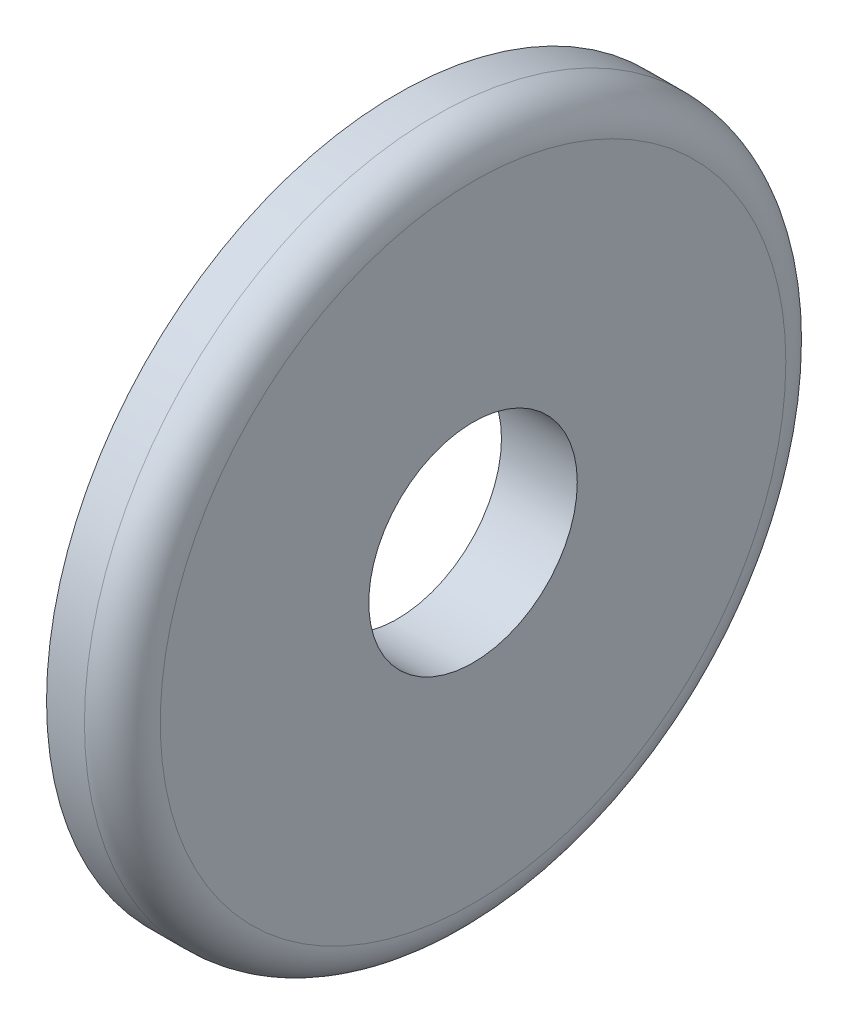
ISO-10303-21;
HEADER;
FILE_DESCRIPTION(('STEP AP214'),'2;1');
FILE_NAME('part.step','',(''),(''),'','','');
FILE_SCHEMA(('AUTOMOTIVE_DESIGN { 1 0 10303 214 1 1 1 1 }'));
ENDSEC;
DATA;
#1=APPLICATION_CONTEXT('core data for automotive mechanical design processes');
#2=APPLICATION_PROTOCOL_DEFINITION('international standard','automotive_design',2000,#1);
#3=PRODUCT_CONTEXT('',#1,'mechanical');
#4=PRODUCT('Part','Part','',(#3));
#5=PRODUCT_RELATED_PRODUCT_CATEGORY('part','',(#4));
#6=PRODUCT_DEFINITION_FORMATION('','',#4);
#7=PRODUCT_DEFINITION_CONTEXT('part definition',#1,'design');
#8=PRODUCT_DEFINITION('design','',#6,#7);
#9=PRODUCT_DEFINITION_SHAPE('','',#8);
#10=(LENGTH_UNIT() NAMED_UNIT(*) SI_UNIT(.MILLI.,.METRE.));
#11=(NAMED_UNIT(*) PLANE_ANGLE_UNIT() SI_UNIT($,.RADIAN.));
#12=(NAMED_UNIT(*) SI_UNIT($,.STERADIAN.) SOLID_ANGLE_UNIT());
#13=UNCERTAINTY_MEASURE_WITH_UNIT(LENGTH_MEASURE(1.E-05),#10,'distance_accuracy_value','');
#14=(GEOMETRIC_REPRESENTATION_CONTEXT(3) GLOBAL_UNCERTAINTY_ASSIGNED_CONTEXT((#13)) GLOBAL_UNIT_ASSIGNED_CONTEXT((#10,
#11,#12)) REPRESENTATION_CONTEXT('',''));
#15=CARTESIAN_POINT('',(0.,0.,0.));
#16=DIRECTION('',(0.,0.,1.));
#17=DIRECTION('',(1.,0.,0.));
#18=AXIS2_PLACEMENT_3D('',#15,#16,#17);
#19=CARTESIAN_POINT('',(4.,0.,0.));
#20=DIRECTION('',(1.,0.,0.));
#21=DIRECTION('',(0.,0.,-1.));
#22=AXIS2_PLACEMENT_3D('',#19,#20,#21);
#23=PLANE('',#22);
#24=CARTESIAN_POINT('',(4.,0.,0.));
#25=DIRECTION('',(1.,0.,0.));
#26=DIRECTION('',(0.,0.,-1.));
#27=AXIS2_PLACEMENT_3D('',#24,#25,#26);
#28=CIRCLE('',#27,16.5);
#29=CARTESIAN_POINT('',(4.,0.,-16.5));
#30=VERTEX_POINT('',#29);
#31=EDGE_CURVE('E37',#30,#30,#28,.T.);
#32=ORIENTED_EDGE('',*,*,#31,.T.);
#33=EDGE_LOOP('',(#32));
#34=FACE_BOUND('',#33,.T.);
#35=CARTESIAN_POINT('',(4.,0.,0.));
#36=DIRECTION('',(1.,0.,0.));
#37=DIRECTION('',(0.,0.,-1.));
#38=AXIS2_PLACEMENT_3D('',#35,#36,#37);
#39=CIRCLE('',#38,5.5);
#40=CARTESIAN_POINT('',(4.,0.,-5.5));
#41=VERTEX_POINT('',#40);
#42=EDGE_CURVE('E45',#41,#41,#39,.T.);
#43=ORIENTED_EDGE('',*,*,#42,.F.);
#44=EDGE_LOOP('',(#43));
#45=FACE_BOUND('',#44,.T.);
#46=ADVANCED_FACE('F30',(#34,#45),#23,.T.);
#47=CARTESIAN_POINT('',(0.,0.,0.));
#48=DIRECTION('',(1.,0.,0.));
#49=DIRECTION('',(0.,0.,-1.));
#50=AXIS2_PLACEMENT_3D('',#47,#48,#49);
#51=PLANE('',#50);
#52=CARTESIAN_POINT('',(0.,0.,0.));
#53=DIRECTION('',(1.,0.,0.));
#54=DIRECTION('',(0.,0.,-1.));
#55=AXIS2_PLACEMENT_3D('',#52,#53,#54);
#56=CIRCLE('',#55,18.5);
#57=CARTESIAN_POINT('',(0.,0.,-18.5));
#58=VERTEX_POINT('',#57);
#59=EDGE_CURVE('E41',#58,#58,#56,.T.);
#60=ORIENTED_EDGE('',*,*,#59,.F.);
#61=EDGE_LOOP('',(#60));
#62=FACE_BOUND('',#61,.T.);
#63=CARTESIAN_POINT('',(0.,0.,0.));
#64=DIRECTION('',(1.,0.,0.));
#65=DIRECTION('',(0.,0.,-1.));
#66=AXIS2_PLACEMENT_3D('',#63,#64,#65);
#67=CIRCLE('',#66,5.5);
#68=CARTESIAN_POINT('',(0.,0.,-5.5));
#69=VERTEX_POINT('',#68);
#70=EDGE_CURVE('E48',#69,#69,#67,.T.);
#71=ORIENTED_EDGE('',*,*,#70,.T.);
#72=EDGE_LOOP('',(#71));
#73=FACE_BOUND('',#72,.T.);
#74=ADVANCED_FACE('F58',(#62,#73),#51,.F.);
#75=CARTESIAN_POINT('',(4.,0.,0.));
#76=DIRECTION('',(-1.,0.,0.));
#77=DIRECTION('',(0.,0.,1.));
#78=AXIS2_PLACEMENT_3D('',#75,#76,#77);
#79=CYLINDRICAL_SURFACE('',#78,18.5);
#80=CARTESIAN_POINT('',(2.,0.,0.));
#81=DIRECTION('',(1.,0.,0.));
#82=DIRECTION('',(0.,0.,-1.));
#83=AXIS2_PLACEMENT_3D('',#80,#81,#82);
#84=CIRCLE('',#83,18.5);
#85=CARTESIAN_POINT('',(2.,0.,-18.5));
#86=VERTEX_POINT('',#85);
#87=EDGE_CURVE('E10',#86,#86,#84,.F.);
#88=ORIENTED_EDGE('',*,*,#87,.T.);
#89=EDGE_LOOP('',(#88));
#90=FACE_BOUND('',#89,.T.);
#91=ORIENTED_EDGE('',*,*,#59,.T.);
#92=EDGE_LOOP('',(#91));
#93=FACE_BOUND('',#92,.T.);
#94=ADVANCED_FACE('F63',(#90,#93),#79,.T.);
#95=CARTESIAN_POINT('',(4.,0.,0.));
#96=DIRECTION('',(-1.,0.,0.));
#97=DIRECTION('',(0.,0.,1.));
#98=AXIS2_PLACEMENT_3D('',#95,#96,#97);
#99=CYLINDRICAL_SURFACE('',#98,5.5);
#100=ORIENTED_EDGE('',*,*,#42,.T.);
#101=EDGE_LOOP('',(#100));
#102=FACE_BOUND('',#101,.T.);
#103=ORIENTED_EDGE('',*,*,#70,.F.);
#104=EDGE_LOOP('',(#103));
#105=FACE_BOUND('',#104,.T.);
#106=ADVANCED_FACE('F54',(#102,#105),#99,.F.);
#107=CARTESIAN_POINT('',(2.,0.,0.));
#108=DIRECTION('',(1.,0.,0.));
#109=DIRECTION('',(0.,0.,-1.));
#110=AXIS2_PLACEMENT_3D('',#107,#108,#109);
#111=TOROIDAL_SURFACE('',#110,16.5,2.);
#112=ORIENTED_EDGE('',*,*,#87,.F.);
#113=EDGE_LOOP('',(#112));
#114=FACE_BOUND('',#113,.T.);
#115=ORIENTED_EDGE('',*,*,#31,.F.);
#116=EDGE_LOOP('',(#115));
#117=FACE_BOUND('',#116,.T.);
#118=ADVANCED_FACE('F32',(#114,#117),#111,.T.);
#119=CLOSED_SHELL('',(#46,#74,#94,#106,#118));
#120=MANIFOLD_SOLID_BREP('B2',#119);
#121=ADVANCED_BREP_SHAPE_REPRESENTATION('',(#18,#120),#14);
#122=SHAPE_DEFINITION_REPRESENTATION(#9,#121);
ENDSEC;
END-ISO-10303-21;
